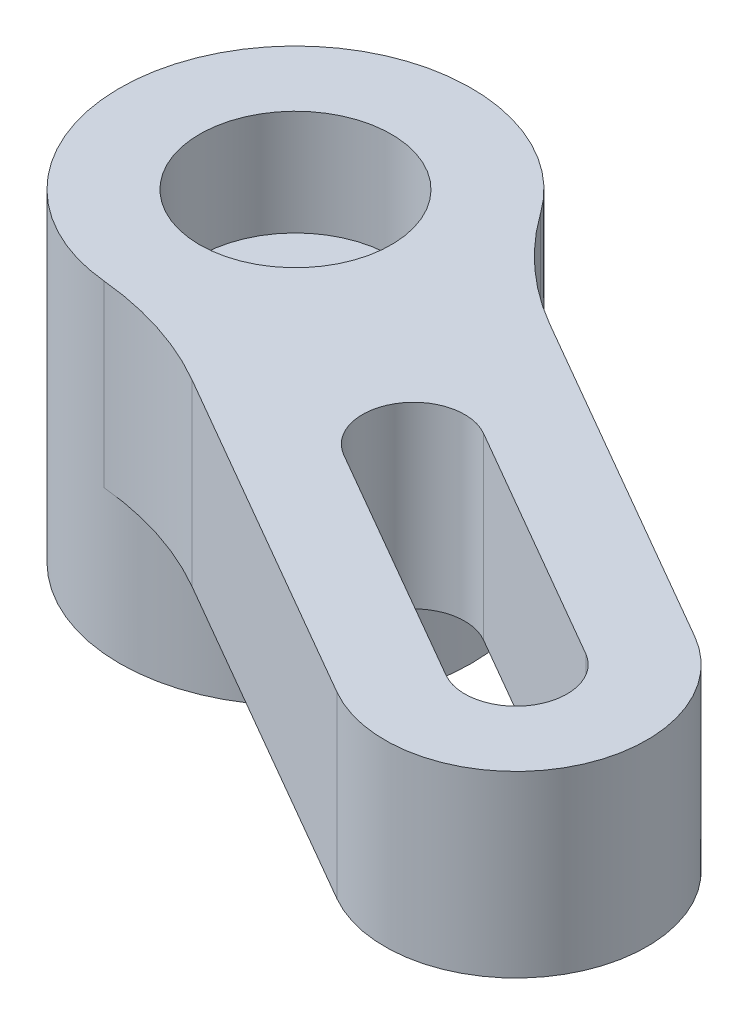
ISO-10303-21;
HEADER;
FILE_DESCRIPTION(('STEP AP214'),'2;1');
FILE_NAME('part.step','',(''),(''),'','','');
FILE_SCHEMA(('AUTOMOTIVE_DESIGN { 1 0 10303 214 1 1 1 1 }'));
ENDSEC;
DATA;
#1=APPLICATION_CONTEXT('core data for automotive mechanical design processes');
#2=APPLICATION_PROTOCOL_DEFINITION('international standard','automotive_design',2000,#1);
#3=PRODUCT_CONTEXT('',#1,'mechanical');
#4=PRODUCT('Part','Part','',(#3));
#5=PRODUCT_RELATED_PRODUCT_CATEGORY('part','',(#4));
#6=PRODUCT_DEFINITION_FORMATION('','',#4);
#7=PRODUCT_DEFINITION_CONTEXT('part definition',#1,'design');
#8=PRODUCT_DEFINITION('design','',#6,#7);
#9=PRODUCT_DEFINITION_SHAPE('','',#8);
#10=(LENGTH_UNIT() NAMED_UNIT(*) SI_UNIT(.MILLI.,.METRE.));
#11=(NAMED_UNIT(*) PLANE_ANGLE_UNIT() SI_UNIT($,.RADIAN.));
#12=(NAMED_UNIT(*) SI_UNIT($,.STERADIAN.) SOLID_ANGLE_UNIT());
#13=UNCERTAINTY_MEASURE_WITH_UNIT(LENGTH_MEASURE(1.E-05),#10,'distance_accuracy_value','');
#14=(GEOMETRIC_REPRESENTATION_CONTEXT(3) GLOBAL_UNCERTAINTY_ASSIGNED_CONTEXT((#13)) GLOBAL_UNIT_ASSIGNED_CONTEXT((#10,
#11,#12)) REPRESENTATION_CONTEXT('',''));
#15=CARTESIAN_POINT('',(0.,0.,0.));
#16=DIRECTION('',(0.,0.,1.));
#17=DIRECTION('',(1.,0.,0.));
#18=AXIS2_PLACEMENT_3D('',#15,#16,#17);
#19=CARTESIAN_POINT('',(16.3245788613367,5.6,9.42499999999996));
#20=DIRECTION('',(0.,1.,0.));
#21=DIRECTION('',(0.,0.,1.));
#22=AXIS2_PLACEMENT_3D('',#19,#20,#21);
#23=PLANE('',#22);
#24=CARTESIAN_POINT('',(0.,5.6,0.));
#25=DIRECTION('',(0.,1.,0.));
#26=DIRECTION('',(0.,0.,1.));
#27=AXIS2_PLACEMENT_3D('',#24,#25,#26);
#28=CIRCLE('',#27,3.);
#29=CARTESIAN_POINT('',(0.,5.6,3.));
#30=VERTEX_POINT('',#29);
#31=EDGE_CURVE('E245',#30,#30,#28,.T.);
#32=ORIENTED_EDGE('',*,*,#31,.F.);
#33=EDGE_LOOP('',(#32));
#34=FACE_BOUND('',#33,.T.);
#35=DIRECTION('',(-0.86602540378444,0.,-0.499999999999998));
#36=VECTOR('',#35,1.);
#37=CARTESIAN_POINT('',(18.3745788613367,5.6,5.87429584448375));
#38=LINE('',#37,#36);
#39=CARTESIAN_POINT('',(18.3745788613367,5.6,5.87429584448375));
#40=VERTEX_POINT('',#39);
#41=CARTESIAN_POINT('',(7.62494394590653,5.6,-0.332008767630018));
#42=VERTEX_POINT('',#41);
#43=EDGE_CURVE('E185',#40,#42,#38,.T.);
#44=ORIENTED_EDGE('',*,*,#43,.T.);
#45=CARTESIAN_POINT('',(12.6249439459065,5.6,-8.99226280547441));
#46=DIRECTION('',(0.,1.,0.));
#47=DIRECTION('',(0.,0.,1.));
#48=AXIS2_PLACEMENT_3D('',#45,#46,#47);
#49=CIRCLE('',#48,10.);
#50=CARTESIAN_POINT('',(4.47981881951521,5.6,-3.19080293097479));
#51=VERTEX_POINT('',#50);
#52=EDGE_CURVE('E212',#42,#51,#49,.F.);
#53=ORIENTED_EDGE('',*,*,#52,.T.);
#54=CARTESIAN_POINT('',(0.,5.6,0.));
#55=DIRECTION('',(0.,1.,0.));
#56=DIRECTION('',(0.,0.,1.));
#57=AXIS2_PLACEMENT_3D('',#54,#55,#56);
#58=CIRCLE('',#57,5.5);
#59=CARTESIAN_POINT('',(-0.523406986936372,5.6,5.47503836753919));
#60=VERTEX_POINT('',#59);
#61=EDGE_CURVE('E227',#51,#60,#58,.T.);
#62=ORIENTED_EDGE('',*,*,#61,.T.);
#63=CARTESIAN_POINT('',(-1.47505605409341,5.6,15.4296535812468));
#64=DIRECTION('',(0.,1.,0.));
#65=DIRECTION('',(0.,0.,1.));
#66=AXIS2_PLACEMENT_3D('',#63,#64,#65);
#67=CIRCLE('',#66,10.);
#68=CARTESIAN_POINT('',(3.52494394590656,5.6,6.76939954340241));
#69=VERTEX_POINT('',#68);
#70=EDGE_CURVE('E69',#60,#69,#67,.F.);
#71=ORIENTED_EDGE('',*,*,#70,.T.);
#72=DIRECTION('',(-0.86602540378444,0.,-0.499999999999998));
#73=VECTOR('',#72,1.);
#74=CARTESIAN_POINT('',(14.2745788613367,5.6,12.9757041555162));
#75=LINE('',#74,#73);
#76=CARTESIAN_POINT('',(14.2745788613367,5.6,12.9757041555162));
#77=VERTEX_POINT('',#76);
#78=EDGE_CURVE('E189',#77,#69,#75,.T.);
#79=ORIENTED_EDGE('',*,*,#78,.F.);
#80=CARTESIAN_POINT('',(16.3245788613367,5.6,9.42499999999996));
#81=DIRECTION('',(0.,1.,0.));
#82=DIRECTION('',(1.,0.,0.));
#83=AXIS2_PLACEMENT_3D('',#80,#81,#82);
#84=CIRCLE('',#83,4.1);
#85=EDGE_CURVE('E182',#77,#40,#84,.T.);
#86=ORIENTED_EDGE('',*,*,#85,.T.);
#87=EDGE_LOOP('',(#44,#53,#62,#71,#79,#86));
#88=FACE_BOUND('',#87,.T.);
#89=CARTESIAN_POINT('',(8.74685657822284,5.6,5.04999999999998));
#90=DIRECTION('',(0.,1.,0.));
#91=DIRECTION('',(0.,0.,1.));
#92=AXIS2_PLACEMENT_3D('',#89,#90,#91);
#93=CIRCLE('',#92,1.6);
#94=CARTESIAN_POINT('',(9.54685657822285,5.6,3.66435935394487));
#95=VERTEX_POINT('',#94);
#96=CARTESIAN_POINT('',(7.94685657822285,5.6,6.43564064605508));
#97=VERTEX_POINT('',#96);
#98=EDGE_CURVE('E162',#95,#97,#93,.T.);
#99=ORIENTED_EDGE('',*,*,#98,.F.);
#100=DIRECTION('',(-0.86602540378444,0.,-0.499999999999998));
#101=VECTOR('',#100,1.);
#102=CARTESIAN_POINT('',(17.1245788613367,5.6,8.03935935394485));
#103=LINE('',#102,#101);
#104=CARTESIAN_POINT('',(17.1245788613367,5.6,8.03935935394485));
#105=VERTEX_POINT('',#104);
#106=EDGE_CURVE('E149',#105,#95,#103,.T.);
#107=ORIENTED_EDGE('',*,*,#106,.F.);
#108=CARTESIAN_POINT('',(16.3245788613367,5.6,9.42499999999996));
#109=DIRECTION('',(0.,1.,0.));
#110=DIRECTION('',(0.,0.,1.));
#111=AXIS2_PLACEMENT_3D('',#108,#109,#110);
#112=CIRCLE('',#111,1.6);
#113=CARTESIAN_POINT('',(15.5245788613367,5.6,10.8106406460551));
#114=VERTEX_POINT('',#113);
#115=EDGE_CURVE('E139',#114,#105,#112,.T.);
#116=ORIENTED_EDGE('',*,*,#115,.F.);
#117=DIRECTION('',(-0.86602540378444,0.,-0.499999999999998));
#118=VECTOR('',#117,1.);
#119=CARTESIAN_POINT('',(15.5245788613367,5.6,10.8106406460551));
#120=LINE('',#119,#118);
#121=EDGE_CURVE('E164',#114,#97,#120,.T.);
#122=ORIENTED_EDGE('',*,*,#121,.T.);
#123=EDGE_LOOP('',(#99,#107,#116,#122));
#124=FACE_BOUND('',#123,.T.);
#125=ADVANCED_FACE('F61',(#34,#88,#124),#23,.T.);
#126=CARTESIAN_POINT('',(16.3245788613367,0.,9.42499999999996));
#127=DIRECTION('',(0.,1.,0.));
#128=DIRECTION('',(0.,0.,1.));
#129=AXIS2_PLACEMENT_3D('',#126,#127,#128);
#130=PLANE('',#129);
#131=DIRECTION('',(-0.86602540378444,0.,-0.499999999999998));
#132=VECTOR('',#131,1.);
#133=CARTESIAN_POINT('',(17.1245788613367,0.,8.03935935394485));
#134=LINE('',#133,#132);
#135=CARTESIAN_POINT('',(17.1245788613367,0.,8.03935935394485));
#136=VERTEX_POINT('',#135);
#137=CARTESIAN_POINT('',(9.54685657822285,0.,3.66435935394487));
#138=VERTEX_POINT('',#137);
#139=EDGE_CURVE('E156',#136,#138,#134,.T.);
#140=ORIENTED_EDGE('',*,*,#139,.T.);
#141=CARTESIAN_POINT('',(8.74685657822284,0.,5.04999999999998));
#142=DIRECTION('',(0.,1.,0.));
#143=DIRECTION('',(0.,0.,1.));
#144=AXIS2_PLACEMENT_3D('',#141,#142,#143);
#145=CIRCLE('',#144,1.6);
#146=CARTESIAN_POINT('',(7.94685657822285,0.,6.43564064605508));
#147=VERTEX_POINT('',#146);
#148=EDGE_CURVE('E173',#138,#147,#145,.T.);
#149=ORIENTED_EDGE('',*,*,#148,.T.);
#150=DIRECTION('',(-0.86602540378444,0.,-0.499999999999998));
#151=VECTOR('',#150,1.);
#152=CARTESIAN_POINT('',(15.5245788613367,0.,10.8106406460551));
#153=LINE('',#152,#151);
#154=CARTESIAN_POINT('',(15.5245788613367,0.,10.8106406460551));
#155=VERTEX_POINT('',#154);
#156=EDGE_CURVE('E150',#155,#147,#153,.T.);
#157=ORIENTED_EDGE('',*,*,#156,.F.);
#158=CARTESIAN_POINT('',(16.3245788613367,0.,9.42499999999996));
#159=DIRECTION('',(0.,1.,0.));
#160=DIRECTION('',(0.,0.,1.));
#161=AXIS2_PLACEMENT_3D('',#158,#159,#160);
#162=CIRCLE('',#161,1.6);
#163=EDGE_CURVE('E169',#155,#136,#162,.T.);
#164=ORIENTED_EDGE('',*,*,#163,.T.);
#165=EDGE_LOOP('',(#140,#149,#157,#164));
#166=FACE_BOUND('',#165,.T.);
#167=DIRECTION('',(-0.86602540378444,0.,-0.499999999999998));
#168=VECTOR('',#167,1.);
#169=CARTESIAN_POINT('',(14.2745788613367,0.,12.9757041555162));
#170=LINE('',#169,#168);
#171=CARTESIAN_POINT('',(14.2745788613367,0.,12.9757041555162));
#172=VERTEX_POINT('',#171);
#173=CARTESIAN_POINT('',(3.52494394590656,0.,6.76939954340241));
#174=VERTEX_POINT('',#173);
#175=EDGE_CURVE('E186',#172,#174,#170,.T.);
#176=ORIENTED_EDGE('',*,*,#175,.T.);
#177=CARTESIAN_POINT('',(-1.47505605409341,0.,15.4296535812468));
#178=DIRECTION('',(0.,1.,0.));
#179=DIRECTION('',(0.,0.,1.));
#180=AXIS2_PLACEMENT_3D('',#177,#178,#179);
#181=CIRCLE('',#180,10.);
#182=CARTESIAN_POINT('',(-0.523406986936372,0.,5.47503836753919));
#183=VERTEX_POINT('',#182);
#184=EDGE_CURVE('E13',#174,#183,#181,.T.);
#185=ORIENTED_EDGE('',*,*,#184,.T.);
#186=CARTESIAN_POINT('',(0.,0.,0.));
#187=DIRECTION('',(0.,1.,0.));
#188=DIRECTION('',(0.,0.,1.));
#189=AXIS2_PLACEMENT_3D('',#186,#187,#188);
#190=CIRCLE('',#189,5.5);
#191=CARTESIAN_POINT('',(4.47981881951521,0.,-3.19080293097479));
#192=VERTEX_POINT('',#191);
#193=EDGE_CURVE('E171',#183,#192,#190,.T.);
#194=ORIENTED_EDGE('',*,*,#193,.T.);
#195=CARTESIAN_POINT('',(12.6249439459065,0.,-8.99226280547441));
#196=DIRECTION('',(0.,1.,0.));
#197=DIRECTION('',(0.,0.,1.));
#198=AXIS2_PLACEMENT_3D('',#195,#196,#197);
#199=CIRCLE('',#198,10.);
#200=CARTESIAN_POINT('',(7.62494394590653,0.,-0.332008767630018));
#201=VERTEX_POINT('',#200);
#202=EDGE_CURVE('E214',#192,#201,#199,.T.);
#203=ORIENTED_EDGE('',*,*,#202,.T.);
#204=DIRECTION('',(-0.86602540378444,0.,-0.499999999999998));
#205=VECTOR('',#204,1.);
#206=CARTESIAN_POINT('',(18.3745788613367,0.,5.87429584448375));
#207=LINE('',#206,#205);
#208=CARTESIAN_POINT('',(18.3745788613367,0.,5.87429584448375));
#209=VERTEX_POINT('',#208);
#210=EDGE_CURVE('E194',#209,#201,#207,.T.);
#211=ORIENTED_EDGE('',*,*,#210,.F.);
#212=CARTESIAN_POINT('',(16.3245788613367,0.,9.42499999999996));
#213=DIRECTION('',(0.,1.,0.));
#214=DIRECTION('',(1.,0.,0.));
#215=AXIS2_PLACEMENT_3D('',#212,#213,#214);
#216=CIRCLE('',#215,4.1);
#217=EDGE_CURVE('E157',#172,#209,#216,.T.);
#218=ORIENTED_EDGE('',*,*,#217,.F.);
#219=EDGE_LOOP('',(#176,#185,#194,#203,#211,#218));
#220=FACE_BOUND('',#219,.T.);
#221=ADVANCED_FACE('F217',(#166,#220),#130,.F.);
#222=CARTESIAN_POINT('',(16.3245788613367,5.6,9.42499999999996));
#223=DIRECTION('',(0.,-1.,0.));
#224=DIRECTION('',(0.,0.,-1.));
#225=AXIS2_PLACEMENT_3D('',#222,#223,#224);
#226=CYLINDRICAL_SURFACE('',#225,4.1);
#227=ORIENTED_EDGE('',*,*,#217,.T.);
#228=DIRECTION('',(0.,-1.,0.));
#229=VECTOR('',#228,1.);
#230=CARTESIAN_POINT('',(18.3745788613367,5.6,5.87429584448375));
#231=LINE('',#230,#229);
#232=EDGE_CURVE('E199',#40,#209,#231,.T.);
#233=ORIENTED_EDGE('',*,*,#232,.F.);
#234=ORIENTED_EDGE('',*,*,#85,.F.);
#235=DIRECTION('',(0.,-1.,0.));
#236=VECTOR('',#235,1.);
#237=CARTESIAN_POINT('',(14.2745788613367,5.6,12.9757041555162));
#238=LINE('',#237,#236);
#239=EDGE_CURVE('E191',#77,#172,#238,.T.);
#240=ORIENTED_EDGE('',*,*,#239,.T.);
#241=EDGE_LOOP('',(#227,#233,#234,#240));
#242=FACE_BOUND('',#241,.T.);
#243=ADVANCED_FACE('F279',(#242),#226,.T.);
#244=CARTESIAN_POINT('',(18.3745788613367,5.6,5.87429584448375));
#245=DIRECTION('',(-0.499999999999998,0.,0.86602540378444));
#246=DIRECTION('',(0.86602540378444,0.,0.499999999999998));
#247=AXIS2_PLACEMENT_3D('',#244,#245,#246);
#248=PLANE('',#247);
#249=ORIENTED_EDGE('',*,*,#210,.T.);
#250=DIRECTION('',(0.,1.,0.));
#251=VECTOR('',#250,1.);
#252=CARTESIAN_POINT('',(7.62494394590653,5.6,-0.332008767630015));
#253=LINE('',#252,#251);
#254=EDGE_CURVE('E202',#201,#42,#253,.T.);
#255=ORIENTED_EDGE('',*,*,#254,.T.);
#256=ORIENTED_EDGE('',*,*,#43,.F.);
#257=ORIENTED_EDGE('',*,*,#232,.T.);
#258=EDGE_LOOP('',(#249,#255,#256,#257));
#259=FACE_BOUND('',#258,.T.);
#260=ADVANCED_FACE('F223',(#259),#248,.F.);
#261=CARTESIAN_POINT('',(14.2745788613367,5.6,12.9757041555162));
#262=DIRECTION('',(-0.499999999999998,0.,0.86602540378444));
#263=DIRECTION('',(0.86602540378444,0.,0.499999999999998));
#264=AXIS2_PLACEMENT_3D('',#261,#262,#263);
#265=PLANE('',#264);
#266=ORIENTED_EDGE('',*,*,#78,.T.);
#267=DIRECTION('',(0.,-1.,0.));
#268=VECTOR('',#267,1.);
#269=CARTESIAN_POINT('',(3.52494394590656,0.,6.76939954340241));
#270=LINE('',#269,#268);
#271=EDGE_CURVE('E82',#69,#174,#270,.T.);
#272=ORIENTED_EDGE('',*,*,#271,.T.);
#273=ORIENTED_EDGE('',*,*,#175,.F.);
#274=ORIENTED_EDGE('',*,*,#239,.F.);
#275=EDGE_LOOP('',(#266,#272,#273,#274));
#276=FACE_BOUND('',#275,.T.);
#277=ADVANCED_FACE('F286',(#276),#265,.T.);
#278=CARTESIAN_POINT('',(16.3245788613367,5.6,9.42499999999996));
#279=DIRECTION('',(0.,-1.,0.));
#280=DIRECTION('',(0.,0.,-1.));
#281=AXIS2_PLACEMENT_3D('',#278,#279,#280);
#282=CYLINDRICAL_SURFACE('',#281,1.6);
#283=ORIENTED_EDGE('',*,*,#163,.F.);
#284=DIRECTION('',(0.,-1.,0.));
#285=VECTOR('',#284,1.);
#286=CARTESIAN_POINT('',(15.5245788613367,5.6,10.8106406460551));
#287=LINE('',#286,#285);
#288=EDGE_CURVE('E145',#114,#155,#287,.T.);
#289=ORIENTED_EDGE('',*,*,#288,.F.);
#290=ORIENTED_EDGE('',*,*,#115,.T.);
#291=DIRECTION('',(0.,-1.,0.));
#292=VECTOR('',#291,1.);
#293=CARTESIAN_POINT('',(17.1245788613367,5.6,8.03935935394485));
#294=LINE('',#293,#292);
#295=EDGE_CURVE('E142',#105,#136,#294,.T.);
#296=ORIENTED_EDGE('',*,*,#295,.T.);
#297=EDGE_LOOP('',(#283,#289,#290,#296));
#298=FACE_BOUND('',#297,.T.);
#299=ADVANCED_FACE('F141',(#298),#282,.F.);
#300=CARTESIAN_POINT('',(17.1245788613367,5.6,8.03935935394485));
#301=DIRECTION('',(-0.499999999999998,0.,0.86602540378444));
#302=DIRECTION('',(0.86602540378444,0.,0.499999999999998));
#303=AXIS2_PLACEMENT_3D('',#300,#301,#302);
#304=PLANE('',#303);
#305=DIRECTION('',(0.,-1.,0.));
#306=VECTOR('',#305,1.);
#307=CARTESIAN_POINT('',(9.54685657822285,5.6,3.66435935394487));
#308=LINE('',#307,#306);
#309=EDGE_CURVE('E158',#95,#138,#308,.T.);
#310=ORIENTED_EDGE('',*,*,#309,.T.);
#311=ORIENTED_EDGE('',*,*,#139,.F.);
#312=ORIENTED_EDGE('',*,*,#295,.F.);
#313=ORIENTED_EDGE('',*,*,#106,.T.);
#314=EDGE_LOOP('',(#310,#311,#312,#313));
#315=FACE_BOUND('',#314,.T.);
#316=ADVANCED_FACE('F154',(#315),#304,.T.);
#317=CARTESIAN_POINT('',(8.74685657822284,5.6,5.04999999999998));
#318=DIRECTION('',(0.,-1.,0.));
#319=DIRECTION('',(0.,0.,-1.));
#320=AXIS2_PLACEMENT_3D('',#317,#318,#319);
#321=CYLINDRICAL_SURFACE('',#320,1.6);
#322=ORIENTED_EDGE('',*,*,#148,.F.);
#323=ORIENTED_EDGE('',*,*,#309,.F.);
#324=ORIENTED_EDGE('',*,*,#98,.T.);
#325=DIRECTION('',(0.,-1.,0.));
#326=VECTOR('',#325,1.);
#327=CARTESIAN_POINT('',(7.94685657822285,5.6,6.43564064605508));
#328=LINE('',#327,#326);
#329=EDGE_CURVE('E178',#97,#147,#328,.T.);
#330=ORIENTED_EDGE('',*,*,#329,.T.);
#331=EDGE_LOOP('',(#322,#323,#324,#330));
#332=FACE_BOUND('',#331,.T.);
#333=ADVANCED_FACE('F316',(#332),#321,.F.);
#334=CARTESIAN_POINT('',(15.5245788613367,5.6,10.8106406460551));
#335=DIRECTION('',(-0.499999999999998,0.,0.86602540378444));
#336=DIRECTION('',(0.86602540378444,0.,0.499999999999998));
#337=AXIS2_PLACEMENT_3D('',#334,#335,#336);
#338=PLANE('',#337);
#339=ORIENTED_EDGE('',*,*,#329,.F.);
#340=ORIENTED_EDGE('',*,*,#121,.F.);
#341=ORIENTED_EDGE('',*,*,#288,.T.);
#342=ORIENTED_EDGE('',*,*,#156,.T.);
#343=EDGE_LOOP('',(#339,#340,#341,#342));
#344=FACE_BOUND('',#343,.T.);
#345=ADVANCED_FACE('F306',(#344),#338,.F.);
#346=CARTESIAN_POINT('',(0.,-4.5,0.));
#347=DIRECTION('',(0.,1.,0.));
#348=DIRECTION('',(0.,0.,1.));
#349=AXIS2_PLACEMENT_3D('',#346,#347,#348);
#350=CYLINDRICAL_SURFACE('',#349,5.5);
#351=CARTESIAN_POINT('',(0.,-4.5,0.));
#352=DIRECTION('',(0.,1.,0.));
#353=DIRECTION('',(0.,0.,1.));
#354=AXIS2_PLACEMENT_3D('',#351,#352,#353);
#355=CIRCLE('',#354,5.5);
#356=CARTESIAN_POINT('',(0.,-4.5,5.5));
#357=VERTEX_POINT('',#356);
#358=EDGE_CURVE('E231',#357,#357,#355,.T.);
#359=ORIENTED_EDGE('',*,*,#358,.T.);
#360=EDGE_LOOP('',(#359));
#361=FACE_BOUND('',#360,.T.);
#362=ORIENTED_EDGE('',*,*,#61,.F.);
#363=DIRECTION('',(0.,1.,0.));
#364=VECTOR('',#363,1.);
#365=CARTESIAN_POINT('',(4.47981881951521,-4.5,-3.19080293097479));
#366=LINE('',#365,#364);
#367=EDGE_CURVE('E208',#51,#192,#366,.F.);
#368=ORIENTED_EDGE('',*,*,#367,.T.);
#369=ORIENTED_EDGE('',*,*,#193,.F.);
#370=DIRECTION('',(0.,1.,0.));
#371=VECTOR('',#370,1.);
#372=CARTESIAN_POINT('',(-0.523406986936372,-4.5,5.47503836753919));
#373=LINE('',#372,#371);
#374=EDGE_CURVE('E205',#183,#60,#373,.T.);
#375=ORIENTED_EDGE('',*,*,#374,.T.);
#376=EDGE_LOOP('',(#362,#368,#369,#375));
#377=FACE_BOUND('',#376,.T.);
#378=ADVANCED_FACE('F229',(#361,#377),#350,.T.);
#379=CARTESIAN_POINT('',(0.,-4.5,0.));
#380=DIRECTION('',(0.,1.,0.));
#381=DIRECTION('',(0.,0.,1.));
#382=AXIS2_PLACEMENT_3D('',#379,#380,#381);
#383=PLANE('',#382);
#384=CARTESIAN_POINT('',(0.,-4.5,0.));
#385=DIRECTION('',(0.,-1.,0.));
#386=DIRECTION('',(0.,0.,-1.));
#387=AXIS2_PLACEMENT_3D('',#384,#385,#386);
#388=CIRCLE('',#387,2.77);
#389=CARTESIAN_POINT('',(0.,-4.5,-2.77));
#390=VERTEX_POINT('',#389);
#391=EDGE_CURVE('E237',#390,#390,#388,.T.);
#392=ORIENTED_EDGE('',*,*,#391,.F.);
#393=EDGE_LOOP('',(#392));
#394=FACE_BOUND('',#393,.T.);
#395=ORIENTED_EDGE('',*,*,#358,.F.);
#396=EDGE_LOOP('',(#395));
#397=FACE_BOUND('',#396,.T.);
#398=ADVANCED_FACE('F294',(#394,#397),#383,.F.);
#399=CARTESIAN_POINT('',(12.6249439459065,-4.5,-8.99226280547441));
#400=DIRECTION('',(0.,1.,0.));
#401=DIRECTION('',(0.,0.,1.));
#402=AXIS2_PLACEMENT_3D('',#399,#400,#401);
#403=CYLINDRICAL_SURFACE('',#402,10.);
#404=ORIENTED_EDGE('',*,*,#202,.F.);
#405=ORIENTED_EDGE('',*,*,#367,.F.);
#406=ORIENTED_EDGE('',*,*,#52,.F.);
#407=ORIENTED_EDGE('',*,*,#254,.F.);
#408=EDGE_LOOP('',(#404,#405,#406,#407));
#409=FACE_BOUND('',#408,.T.);
#410=ADVANCED_FACE('F225',(#409),#403,.F.);
#411=CARTESIAN_POINT('',(-1.47505605409341,-4.5,15.4296535812468));
#412=DIRECTION('',(0.,1.,0.));
#413=DIRECTION('',(0.,0.,1.));
#414=AXIS2_PLACEMENT_3D('',#411,#412,#413);
#415=CYLINDRICAL_SURFACE('',#414,10.);
#416=ORIENTED_EDGE('',*,*,#184,.F.);
#417=ORIENTED_EDGE('',*,*,#271,.F.);
#418=ORIENTED_EDGE('',*,*,#70,.F.);
#419=ORIENTED_EDGE('',*,*,#374,.F.);
#420=EDGE_LOOP('',(#416,#417,#418,#419));
#421=FACE_BOUND('',#420,.T.);
#422=ADVANCED_FACE('F63',(#421),#415,.F.);
#423=CARTESIAN_POINT('',(0.,-0.5,0.));
#424=DIRECTION('',(0.,-1.,0.));
#425=DIRECTION('',(0.,0.,-1.));
#426=AXIS2_PLACEMENT_3D('',#423,#424,#425);
#427=CYLINDRICAL_SURFACE('',#426,2.77);
#428=CARTESIAN_POINT('',(0.,-0.5,0.));
#429=DIRECTION('',(0.,-1.,0.));
#430=DIRECTION('',(0.,0.,-1.));
#431=AXIS2_PLACEMENT_3D('',#428,#429,#430);
#432=CIRCLE('',#431,2.77);
#433=CARTESIAN_POINT('',(0.,-0.5,-2.77));
#434=VERTEX_POINT('',#433);
#435=EDGE_CURVE('E232',#434,#434,#432,.T.);
#436=ORIENTED_EDGE('',*,*,#435,.F.);
#437=EDGE_LOOP('',(#436));
#438=FACE_BOUND('',#437,.T.);
#439=ORIENTED_EDGE('',*,*,#391,.T.);
#440=EDGE_LOOP('',(#439));
#441=FACE_BOUND('',#440,.T.);
#442=ADVANCED_FACE('F299',(#438,#441),#427,.F.);
#443=CARTESIAN_POINT('',(0.,-0.5,0.));
#444=DIRECTION('',(0.,-1.,0.));
#445=DIRECTION('',(0.,0.,-1.));
#446=AXIS2_PLACEMENT_3D('',#443,#444,#445);
#447=PLANE('',#446);
#448=CARTESIAN_POINT('',(0.,-0.5,0.));
#449=DIRECTION('',(0.,-1.,0.));
#450=DIRECTION('',(0.,0.,-1.));
#451=AXIS2_PLACEMENT_3D('',#448,#449,#450);
#452=CIRCLE('',#451,1.6);
#453=CARTESIAN_POINT('',(0.,-0.5,-1.6));
#454=VERTEX_POINT('',#453);
#455=EDGE_CURVE('E248',#454,#454,#452,.T.);
#456=ORIENTED_EDGE('',*,*,#455,.F.);
#457=EDGE_LOOP('',(#456));
#458=FACE_BOUND('',#457,.T.);
#459=ORIENTED_EDGE('',*,*,#435,.T.);
#460=EDGE_LOOP('',(#459));
#461=FACE_BOUND('',#460,.T.);
#462=ADVANCED_FACE('F261',(#458,#461),#447,.T.);
#463=CARTESIAN_POINT('',(0.,2.3,0.));
#464=DIRECTION('',(0.,-1.,0.));
#465=DIRECTION('',(0.,0.,-1.));
#466=AXIS2_PLACEMENT_3D('',#463,#464,#465);
#467=PLANE('',#466);
#468=CARTESIAN_POINT('',(0.,2.3,0.));
#469=DIRECTION('',(0.,1.,0.));
#470=DIRECTION('',(0.,0.,1.));
#471=AXIS2_PLACEMENT_3D('',#468,#469,#470);
#472=CIRCLE('',#471,1.6);
#473=CARTESIAN_POINT('',(0.,2.3,1.6));
#474=VERTEX_POINT('',#473);
#475=EDGE_CURVE('E251',#474,#474,#472,.T.);
#476=ORIENTED_EDGE('',*,*,#475,.F.);
#477=EDGE_LOOP('',(#476));
#478=FACE_BOUND('',#477,.T.);
#479=CARTESIAN_POINT('',(0.,2.3,0.));
#480=DIRECTION('',(0.,-1.,0.));
#481=DIRECTION('',(0.,0.,-1.));
#482=AXIS2_PLACEMENT_3D('',#479,#480,#481);
#483=CIRCLE('',#482,3.);
#484=CARTESIAN_POINT('',(0.,2.3,3.));
#485=VERTEX_POINT('',#484);
#486=EDGE_CURVE('E241',#485,#485,#483,.F.);
#487=ORIENTED_EDGE('',*,*,#486,.T.);
#488=EDGE_LOOP('',(#487));
#489=FACE_BOUND('',#488,.T.);
#490=ADVANCED_FACE('F257',(#478,#489),#467,.F.);
#491=CARTESIAN_POINT('',(0.,-8.98528137423857,0.));
#492=DIRECTION('',(0.,1.,0.));
#493=DIRECTION('',(0.,0.,1.));
#494=AXIS2_PLACEMENT_3D('',#491,#492,#493);
#495=CYLINDRICAL_SURFACE('',#494,3.);
#496=CARTESIAN_POINT('',(0.,5.6,3.));
#497=CARTESIAN_POINT('',(0.,5.565625,3.));
#498=CARTESIAN_POINT('',(0.,5.53125,3.));
#499=CARTESIAN_POINT('',(0.,5.4625,3.));
#500=CARTESIAN_POINT('',(0.,5.428125,3.));
#501=CARTESIAN_POINT('',(0.,5.359375,3.));
#502=CARTESIAN_POINT('',(0.,5.325,3.));
#503=CARTESIAN_POINT('',(0.,5.25625,3.));
#504=CARTESIAN_POINT('',(0.,5.221875,3.));
#505=CARTESIAN_POINT('',(0.,5.153125,3.));
#506=CARTESIAN_POINT('',(0.,5.11875,3.));
#507=CARTESIAN_POINT('',(0.,5.05,3.));
#508=CARTESIAN_POINT('',(0.,5.015625,3.));
#509=CARTESIAN_POINT('',(0.,4.946875,3.));
#510=CARTESIAN_POINT('',(0.,4.9125,3.));
#511=CARTESIAN_POINT('',(0.,4.84375,3.));
#512=CARTESIAN_POINT('',(0.,4.809375,3.));
#513=CARTESIAN_POINT('',(0.,4.740625,3.));
#514=CARTESIAN_POINT('',(0.,4.70625,3.));
#515=CARTESIAN_POINT('',(0.,4.6375,3.));
#516=CARTESIAN_POINT('',(0.,4.603125,3.));
#517=CARTESIAN_POINT('',(0.,4.534375,3.));
#518=CARTESIAN_POINT('',(0.,4.5,3.));
#519=CARTESIAN_POINT('',(0.,4.43125,3.));
#520=CARTESIAN_POINT('',(0.,4.396875,3.));
#521=CARTESIAN_POINT('',(0.,4.328125,3.));
#522=CARTESIAN_POINT('',(0.,4.29375,3.));
#523=CARTESIAN_POINT('',(0.,4.225,3.));
#524=CARTESIAN_POINT('',(0.,4.190625,3.));
#525=CARTESIAN_POINT('',(0.,4.121875,3.));
#526=CARTESIAN_POINT('',(0.,4.0875,3.));
#527=CARTESIAN_POINT('',(0.,4.01875,3.));
#528=CARTESIAN_POINT('',(0.,3.984375,3.));
#529=CARTESIAN_POINT('',(0.,3.915625,3.));
#530=CARTESIAN_POINT('',(0.,3.88125,3.));
#531=CARTESIAN_POINT('',(0.,3.8125,3.));
#532=CARTESIAN_POINT('',(0.,3.778125,3.));
#533=CARTESIAN_POINT('',(0.,3.709375,3.));
#534=CARTESIAN_POINT('',(0.,3.675,3.));
#535=CARTESIAN_POINT('',(0.,3.60625,3.));
#536=CARTESIAN_POINT('',(0.,3.571875,3.));
#537=CARTESIAN_POINT('',(0.,3.503125,3.));
#538=CARTESIAN_POINT('',(0.,3.46875,3.));
#539=CARTESIAN_POINT('',(0.,3.4,3.));
#540=CARTESIAN_POINT('',(0.,3.365625,3.));
#541=CARTESIAN_POINT('',(0.,3.296875,3.));
#542=CARTESIAN_POINT('',(0.,3.2625,3.));
#543=CARTESIAN_POINT('',(0.,3.19375,3.));
#544=CARTESIAN_POINT('',(0.,3.159375,3.));
#545=CARTESIAN_POINT('',(0.,3.090625,3.));
#546=CARTESIAN_POINT('',(0.,3.05625,3.));
#547=CARTESIAN_POINT('',(0.,2.9875,3.));
#548=CARTESIAN_POINT('',(0.,2.953125,3.));
#549=CARTESIAN_POINT('',(0.,2.884375,3.));
#550=CARTESIAN_POINT('',(0.,2.85,3.));
#551=CARTESIAN_POINT('',(0.,2.78125,3.));
#552=CARTESIAN_POINT('',(0.,2.746875,3.));
#553=CARTESIAN_POINT('',(0.,2.678125,3.));
#554=CARTESIAN_POINT('',(0.,2.64375,3.));
#555=CARTESIAN_POINT('',(0.,2.575,3.));
#556=CARTESIAN_POINT('',(0.,2.540625,3.));
#557=CARTESIAN_POINT('',(0.,2.471875,3.));
#558=CARTESIAN_POINT('',(0.,2.4375,3.));
#559=CARTESIAN_POINT('',(0.,2.36875,3.));
#560=CARTESIAN_POINT('',(0.,2.334375,3.));
#561=CARTESIAN_POINT('',(0.,2.3,3.));
#562=B_SPLINE_CURVE_WITH_KNOTS('',3,(#496,#497,#498,#499,#500,#501,#502,#503,#504,#505,#506,
#507,#508,#509,#510,#511,#512,#513,#514,#515,#516,#517,#518,#519,#520,#521,#522,#523,#524,#525,
#526,#527,#528,#529,#530,#531,#532,#533,#534,#535,#536,#537,#538,#539,#540,#541,#542,#543,#544,
#545,#546,#547,#548,#549,#550,#551,#552,#553,#554,#555,#556,#557,#558,#559,#560,#561),
.UNSPECIFIED.,.F.,.F.,(4,2,2,2,2,2,2,2,2,2,2,2,2,2,2,2,2,2,2,2,2,2,2,2,2,2,2,2,2,2,2,2,4),(0.,
0.103124999999999,0.20625,0.309375000000001,0.4125,0.515624999999999,0.618749999999999,0.721875,
0.824999999999999,0.928124999999998,1.03125,1.134375,1.2375,1.340625,1.44375,1.546875,1.65,
1.753125,1.85625,1.959375,2.0625,2.165625,2.26875,2.371875,2.475,2.578125,2.68125,2.784375,
2.8875,2.990625,3.09375,3.196875,3.3),.UNSPECIFIED.);
#563=EDGE_CURVE('BSEAM260',#30,#485,#562,.T.);
#564=ORIENTED_EDGE('',*,*,#31,.T.);
#565=ORIENTED_EDGE('',*,*,#486,.F.);
#566=ORIENTED_EDGE('',*,*,#563,.T.);
#567=ORIENTED_EDGE('',*,*,#563,.F.);
#568=EDGE_LOOP('',(#564,#566,#565,#567));
#569=FACE_BOUND('',#568,.T.);
#570=ADVANCED_FACE('F260',(#569),#495,.F.);
#571=CARTESIAN_POINT('',(0.,-4.5,0.));
#572=DIRECTION('',(0.,1.,0.));
#573=DIRECTION('',(0.,0.,1.));
#574=AXIS2_PLACEMENT_3D('',#571,#572,#573);
#575=CYLINDRICAL_SURFACE('',#574,1.6);
#576=ORIENTED_EDGE('',*,*,#455,.T.);
#577=EDGE_LOOP('',(#576));
#578=FACE_BOUND('',#577,.T.);
#579=ORIENTED_EDGE('',*,*,#475,.T.);
#580=EDGE_LOOP('',(#579));
#581=FACE_BOUND('',#580,.T.);
#582=ADVANCED_FACE('F255',(#578,#581),#575,.F.);
#583=CLOSED_SHELL('',(#125,#221,#243,#260,#277,#299,#316,#333,#345,#378,#398,#410,#422,#442,
#462,#490,#570,#582));
#584=MANIFOLD_SOLID_BREP('B2',#583);
#585=ADVANCED_BREP_SHAPE_REPRESENTATION('',(#18,#584),#14);
#586=SHAPE_DEFINITION_REPRESENTATION(#9,#585);
ENDSEC;
END-ISO-10303-21;
